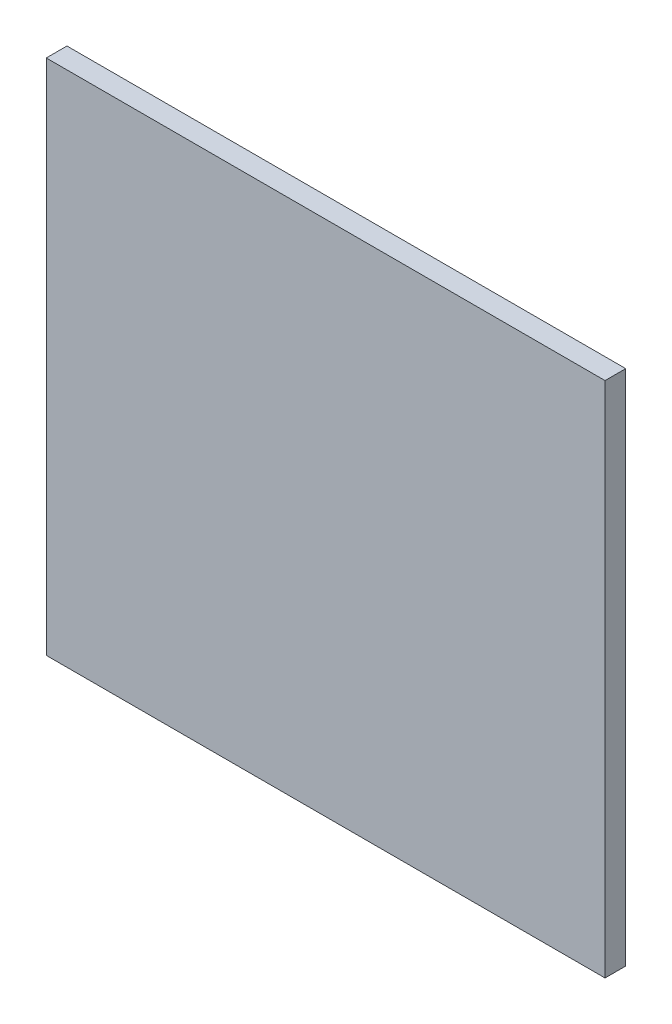
ISO-10303-21;
HEADER;
FILE_DESCRIPTION(('STEP AP214'),'2;1');
FILE_NAME('part.step','',(''),(''),'','','');
FILE_SCHEMA(('AUTOMOTIVE_DESIGN { 1 0 10303 214 1 1 1 1 }'));
ENDSEC;
DATA;
#1=APPLICATION_CONTEXT('core data for automotive mechanical design processes');
#2=APPLICATION_PROTOCOL_DEFINITION('international standard','automotive_design',2000,#1);
#3=PRODUCT_CONTEXT('',#1,'mechanical');
#4=PRODUCT('Part','Part','',(#3));
#5=PRODUCT_RELATED_PRODUCT_CATEGORY('part','',(#4));
#6=PRODUCT_DEFINITION_FORMATION('','',#4);
#7=PRODUCT_DEFINITION_CONTEXT('part definition',#1,'design');
#8=PRODUCT_DEFINITION('design','',#6,#7);
#9=PRODUCT_DEFINITION_SHAPE('','',#8);
#10=(LENGTH_UNIT() NAMED_UNIT(*) SI_UNIT(.MILLI.,.METRE.));
#11=(NAMED_UNIT(*) PLANE_ANGLE_UNIT() SI_UNIT($,.RADIAN.));
#12=(NAMED_UNIT(*) SI_UNIT($,.STERADIAN.) SOLID_ANGLE_UNIT());
#13=UNCERTAINTY_MEASURE_WITH_UNIT(LENGTH_MEASURE(1.E-05),#10,'distance_accuracy_value','');
#14=(GEOMETRIC_REPRESENTATION_CONTEXT(3) GLOBAL_UNCERTAINTY_ASSIGNED_CONTEXT((#13)) GLOBAL_UNIT_ASSIGNED_CONTEXT((#10,
#11,#12)) REPRESENTATION_CONTEXT('',''));
#15=CARTESIAN_POINT('',(0.,0.,0.));
#16=DIRECTION('',(0.,0.,1.));
#17=DIRECTION('',(1.,0.,0.));
#18=AXIS2_PLACEMENT_3D('',#15,#16,#17);
#19=CARTESIAN_POINT('',(67.5,-62.5,5.));
#20=DIRECTION('',(-1.,0.,0.));
#21=DIRECTION('',(0.,0.,1.));
#22=AXIS2_PLACEMENT_3D('',#19,#20,#21);
#23=PLANE('',#22);
#24=DIRECTION('',(0.,1.,0.));
#25=VECTOR('',#24,1.);
#26=CARTESIAN_POINT('',(67.5,-62.5,0.));
#27=LINE('',#26,#25);
#28=CARTESIAN_POINT('',(67.5,-62.5,0.));
#29=VERTEX_POINT('',#28);
#30=CARTESIAN_POINT('',(67.5,62.5,0.));
#31=VERTEX_POINT('',#30);
#32=EDGE_CURVE('E121',#29,#31,#27,.T.);
#33=ORIENTED_EDGE('',*,*,#32,.T.);
#34=DIRECTION('',(0.,0.,-1.));
#35=VECTOR('',#34,1.);
#36=CARTESIAN_POINT('',(67.5,62.5,5.));
#37=LINE('',#36,#35);
#38=CARTESIAN_POINT('',(67.5,62.5,5.));
#39=VERTEX_POINT('',#38);
#40=EDGE_CURVE('E11',#39,#31,#37,.T.);
#41=ORIENTED_EDGE('',*,*,#40,.F.);
#42=DIRECTION('',(0.,1.,0.));
#43=VECTOR('',#42,1.);
#44=CARTESIAN_POINT('',(67.5,-62.5,5.));
#45=LINE('',#44,#43);
#46=CARTESIAN_POINT('',(67.5,-62.5,5.));
#47=VERTEX_POINT('',#46);
#48=EDGE_CURVE('E104',#47,#39,#45,.T.);
#49=ORIENTED_EDGE('',*,*,#48,.F.);
#50=DIRECTION('',(0.,0.,-1.));
#51=VECTOR('',#50,1.);
#52=CARTESIAN_POINT('',(67.5,-62.5,5.));
#53=LINE('',#52,#51);
#54=EDGE_CURVE('E117',#47,#29,#53,.T.);
#55=ORIENTED_EDGE('',*,*,#54,.T.);
#56=EDGE_LOOP('',(#33,#41,#49,#55));
#57=FACE_BOUND('',#56,.T.);
#58=ADVANCED_FACE('F44',(#57),#23,.F.);
#59=CARTESIAN_POINT('',(-67.5,62.5,5.));
#60=DIRECTION('',(0.,-1.,0.));
#61=DIRECTION('',(0.,0.,-1.));
#62=AXIS2_PLACEMENT_3D('',#59,#60,#61);
#63=PLANE('',#62);
#64=DIRECTION('',(-1.,0.,0.));
#65=VECTOR('',#64,1.);
#66=CARTESIAN_POINT('',(-67.5,62.5,0.));
#67=LINE('',#66,#65);
#68=CARTESIAN_POINT('',(-67.5,62.5,0.));
#69=VERTEX_POINT('',#68);
#70=EDGE_CURVE('E109',#31,#69,#67,.T.);
#71=ORIENTED_EDGE('',*,*,#70,.T.);
#72=DIRECTION('',(0.,0.,-1.));
#73=VECTOR('',#72,1.);
#74=CARTESIAN_POINT('',(-67.5,62.5,5.));
#75=LINE('',#74,#73);
#76=CARTESIAN_POINT('',(-67.5,62.5,5.));
#77=VERTEX_POINT('',#76);
#78=EDGE_CURVE('E53',#77,#69,#75,.T.);
#79=ORIENTED_EDGE('',*,*,#78,.F.);
#80=DIRECTION('',(-1.,0.,0.));
#81=VECTOR('',#80,1.);
#82=CARTESIAN_POINT('',(-67.5,62.5,5.));
#83=LINE('',#82,#81);
#84=EDGE_CURVE('E98',#39,#77,#83,.T.);
#85=ORIENTED_EDGE('',*,*,#84,.F.);
#86=ORIENTED_EDGE('',*,*,#40,.T.);
#87=EDGE_LOOP('',(#71,#79,#85,#86));
#88=FACE_BOUND('',#87,.T.);
#89=ADVANCED_FACE('F108',(#88),#63,.F.);
#90=CARTESIAN_POINT('',(-67.5,-62.5,5.));
#91=DIRECTION('',(1.,0.,0.));
#92=DIRECTION('',(0.,0.,-1.));
#93=AXIS2_PLACEMENT_3D('',#90,#91,#92);
#94=PLANE('',#93);
#95=DIRECTION('',(0.,-1.,0.));
#96=VECTOR('',#95,1.);
#97=CARTESIAN_POINT('',(-67.5,-62.5,0.));
#98=LINE('',#97,#96);
#99=CARTESIAN_POINT('',(-67.5,-62.5,0.));
#100=VERTEX_POINT('',#99);
#101=EDGE_CURVE('E84',#69,#100,#98,.T.);
#102=ORIENTED_EDGE('',*,*,#101,.T.);
#103=DIRECTION('',(0.,0.,-1.));
#104=VECTOR('',#103,1.);
#105=CARTESIAN_POINT('',(-67.5,-62.5,5.));
#106=LINE('',#105,#104);
#107=CARTESIAN_POINT('',(-67.5,-62.5,5.));
#108=VERTEX_POINT('',#107);
#109=EDGE_CURVE('E111',#108,#100,#106,.T.);
#110=ORIENTED_EDGE('',*,*,#109,.F.);
#111=DIRECTION('',(0.,-1.,0.));
#112=VECTOR('',#111,1.);
#113=CARTESIAN_POINT('',(-67.5,-62.5,5.));
#114=LINE('',#113,#112);
#115=EDGE_CURVE('E102',#77,#108,#114,.T.);
#116=ORIENTED_EDGE('',*,*,#115,.F.);
#117=ORIENTED_EDGE('',*,*,#78,.T.);
#118=EDGE_LOOP('',(#102,#110,#116,#117));
#119=FACE_BOUND('',#118,.T.);
#120=ADVANCED_FACE('F112',(#119),#94,.F.);
#121=CARTESIAN_POINT('',(-67.5,-62.5,5.));
#122=DIRECTION('',(0.,1.,0.));
#123=DIRECTION('',(0.,0.,1.));
#124=AXIS2_PLACEMENT_3D('',#121,#122,#123);
#125=PLANE('',#124);
#126=DIRECTION('',(1.,0.,0.));
#127=VECTOR('',#126,1.);
#128=CARTESIAN_POINT('',(-67.5,-62.5,0.));
#129=LINE('',#128,#127);
#130=EDGE_CURVE('E90',#100,#29,#129,.T.);
#131=ORIENTED_EDGE('',*,*,#130,.T.);
#132=ORIENTED_EDGE('',*,*,#54,.F.);
#133=DIRECTION('',(1.,0.,0.));
#134=VECTOR('',#133,1.);
#135=CARTESIAN_POINT('',(-67.5,-62.5,5.));
#136=LINE('',#135,#134);
#137=EDGE_CURVE('E64',#108,#47,#136,.T.);
#138=ORIENTED_EDGE('',*,*,#137,.F.);
#139=ORIENTED_EDGE('',*,*,#109,.T.);
#140=EDGE_LOOP('',(#131,#132,#138,#139));
#141=FACE_BOUND('',#140,.T.);
#142=ADVANCED_FACE('F133',(#141),#125,.F.);
#143=CARTESIAN_POINT('',(0.,0.,5.));
#144=DIRECTION('',(0.,0.,-1.));
#145=DIRECTION('',(-1.,0.,0.));
#146=AXIS2_PLACEMENT_3D('',#143,#144,#145);
#147=PLANE('',#146);
#148=ORIENTED_EDGE('',*,*,#48,.T.);
#149=ORIENTED_EDGE('',*,*,#84,.T.);
#150=ORIENTED_EDGE('',*,*,#115,.T.);
#151=ORIENTED_EDGE('',*,*,#137,.T.);
#152=EDGE_LOOP('',(#148,#149,#150,#151));
#153=FACE_BOUND('',#152,.T.);
#154=ADVANCED_FACE('F100',(#153),#147,.F.);
#155=CARTESIAN_POINT('',(0.,0.,0.));
#156=DIRECTION('',(0.,0.,-1.));
#157=DIRECTION('',(-1.,0.,0.));
#158=AXIS2_PLACEMENT_3D('',#155,#156,#157);
#159=PLANE('',#158);
#160=ORIENTED_EDGE('',*,*,#32,.F.);
#161=ORIENTED_EDGE('',*,*,#130,.F.);
#162=ORIENTED_EDGE('',*,*,#101,.F.);
#163=ORIENTED_EDGE('',*,*,#70,.F.);
#164=EDGE_LOOP('',(#160,#161,#162,#163));
#165=FACE_BOUND('',#164,.T.);
#166=ADVANCED_FACE('F136',(#165),#159,.T.);
#167=CLOSED_SHELL('',(#58,#89,#120,#142,#154,#166));
#168=MANIFOLD_SOLID_BREP('B2',#167);
#169=ADVANCED_BREP_SHAPE_REPRESENTATION('',(#18,#168),#14);
#170=SHAPE_DEFINITION_REPRESENTATION(#9,#169);
ENDSEC;
END-ISO-10303-21;
